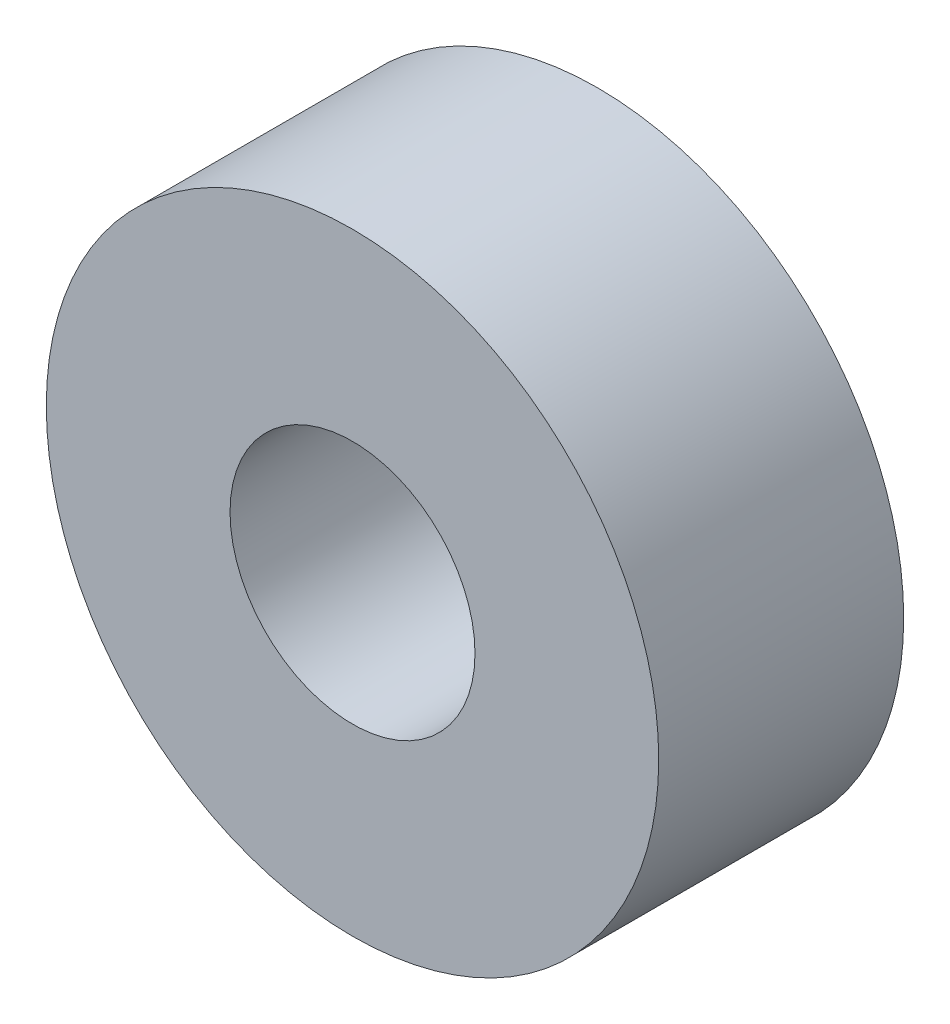
ISO-10303-21;
HEADER;
FILE_DESCRIPTION(('STEP AP214'),'2;1');
FILE_NAME('part.step','',(''),(''),'','','');
FILE_SCHEMA(('AUTOMOTIVE_DESIGN { 1 0 10303 214 1 1 1 1 }'));
ENDSEC;
DATA;
#1=APPLICATION_CONTEXT('core data for automotive mechanical design processes');
#2=APPLICATION_PROTOCOL_DEFINITION('international standard','automotive_design',2000,#1);
#3=PRODUCT_CONTEXT('',#1,'mechanical');
#4=PRODUCT('Part','Part','',(#3));
#5=PRODUCT_RELATED_PRODUCT_CATEGORY('part','',(#4));
#6=PRODUCT_DEFINITION_FORMATION('','',#4);
#7=PRODUCT_DEFINITION_CONTEXT('part definition',#1,'design');
#8=PRODUCT_DEFINITION('design','',#6,#7);
#9=PRODUCT_DEFINITION_SHAPE('','',#8);
#10=(LENGTH_UNIT() NAMED_UNIT(*) SI_UNIT(.MILLI.,.METRE.));
#11=(NAMED_UNIT(*) PLANE_ANGLE_UNIT() SI_UNIT($,.RADIAN.));
#12=(NAMED_UNIT(*) SI_UNIT($,.STERADIAN.) SOLID_ANGLE_UNIT());
#13=UNCERTAINTY_MEASURE_WITH_UNIT(LENGTH_MEASURE(1.E-05),#10,'distance_accuracy_value','');
#14=(GEOMETRIC_REPRESENTATION_CONTEXT(3) GLOBAL_UNCERTAINTY_ASSIGNED_CONTEXT((#13)) GLOBAL_UNIT_ASSIGNED_CONTEXT((#10,
#11,#12)) REPRESENTATION_CONTEXT('',''));
#15=CARTESIAN_POINT('',(0.,0.,0.));
#16=DIRECTION('',(0.,0.,1.));
#17=DIRECTION('',(1.,0.,0.));
#18=AXIS2_PLACEMENT_3D('',#15,#16,#17);
#19=CARTESIAN_POINT('',(0.,0.,4.));
#20=DIRECTION('',(0.,0.,1.));
#21=DIRECTION('',(1.,0.,0.));
#22=AXIS2_PLACEMENT_3D('',#19,#20,#21);
#23=PLANE('',#22);
#24=CARTESIAN_POINT('',(0.,0.,4.));
#25=DIRECTION('',(0.,0.,1.));
#26=DIRECTION('',(1.,0.,0.));
#27=AXIS2_PLACEMENT_3D('',#24,#25,#26);
#28=CIRCLE('',#27,5.);
#29=CARTESIAN_POINT('',(5.,0.,4.));
#30=VERTEX_POINT('',#29);
#31=EDGE_CURVE('E10',#30,#30,#28,.T.);
#32=ORIENTED_EDGE('',*,*,#31,.T.);
#33=EDGE_LOOP('',(#32));
#34=FACE_BOUND('',#33,.T.);
#35=CARTESIAN_POINT('',(0.,0.,4.));
#36=DIRECTION('',(0.,0.,1.));
#37=DIRECTION('',(1.,0.,0.));
#38=AXIS2_PLACEMENT_3D('',#35,#36,#37);
#39=CIRCLE('',#38,2.);
#40=CARTESIAN_POINT('',(2.,0.,4.));
#41=VERTEX_POINT('',#40);
#42=EDGE_CURVE('E50',#41,#41,#39,.T.);
#43=ORIENTED_EDGE('',*,*,#42,.F.);
#44=EDGE_LOOP('',(#43));
#45=FACE_BOUND('',#44,.T.);
#46=ADVANCED_FACE('F37',(#34,#45),#23,.T.);
#47=CARTESIAN_POINT('',(0.,0.,0.));
#48=DIRECTION('',(0.,0.,1.));
#49=DIRECTION('',(1.,0.,0.));
#50=AXIS2_PLACEMENT_3D('',#47,#48,#49);
#51=PLANE('',#50);
#52=CARTESIAN_POINT('',(0.,0.,0.));
#53=DIRECTION('',(0.,0.,1.));
#54=DIRECTION('',(1.,0.,0.));
#55=AXIS2_PLACEMENT_3D('',#52,#53,#54);
#56=CIRCLE('',#55,5.);
#57=CARTESIAN_POINT('',(5.,0.,0.));
#58=VERTEX_POINT('',#57);
#59=EDGE_CURVE('E41',#58,#58,#56,.T.);
#60=ORIENTED_EDGE('',*,*,#59,.F.);
#61=EDGE_LOOP('',(#60));
#62=FACE_BOUND('',#61,.T.);
#63=CARTESIAN_POINT('',(0.,0.,0.));
#64=DIRECTION('',(0.,0.,1.));
#65=DIRECTION('',(1.,0.,0.));
#66=AXIS2_PLACEMENT_3D('',#63,#64,#65);
#67=CIRCLE('',#66,2.);
#68=CARTESIAN_POINT('',(2.,0.,0.));
#69=VERTEX_POINT('',#68);
#70=EDGE_CURVE('E52',#69,#69,#67,.T.);
#71=ORIENTED_EDGE('',*,*,#70,.T.);
#72=EDGE_LOOP('',(#71));
#73=FACE_BOUND('',#72,.T.);
#74=ADVANCED_FACE('F64',(#62,#73),#51,.F.);
#75=CARTESIAN_POINT('',(0.,0.,4.));
#76=DIRECTION('',(0.,0.,-1.));
#77=DIRECTION('',(-1.,0.,0.));
#78=AXIS2_PLACEMENT_3D('',#75,#76,#77);
#79=CYLINDRICAL_SURFACE('',#78,5.);
#80=ORIENTED_EDGE('',*,*,#31,.F.);
#81=EDGE_LOOP('',(#80));
#82=FACE_BOUND('',#81,.T.);
#83=ORIENTED_EDGE('',*,*,#59,.T.);
#84=EDGE_LOOP('',(#83));
#85=FACE_BOUND('',#84,.T.);
#86=ADVANCED_FACE('F39',(#82,#85),#79,.T.);
#87=CARTESIAN_POINT('',(0.,0.,4.));
#88=DIRECTION('',(0.,0.,-1.));
#89=DIRECTION('',(-1.,0.,0.));
#90=AXIS2_PLACEMENT_3D('',#87,#88,#89);
#91=CYLINDRICAL_SURFACE('',#90,2.);
#92=ORIENTED_EDGE('',*,*,#42,.T.);
#93=EDGE_LOOP('',(#92));
#94=FACE_BOUND('',#93,.T.);
#95=ORIENTED_EDGE('',*,*,#70,.F.);
#96=EDGE_LOOP('',(#95));
#97=FACE_BOUND('',#96,.T.);
#98=ADVANCED_FACE('F60',(#94,#97),#91,.F.);
#99=CLOSED_SHELL('',(#46,#74,#86,#98));
#100=MANIFOLD_SOLID_BREP('B2',#99);
#101=ADVANCED_BREP_SHAPE_REPRESENTATION('',(#18,#100),#14);
#102=SHAPE_DEFINITION_REPRESENTATION(#9,#101);
ENDSEC;
END-ISO-10303-21;
